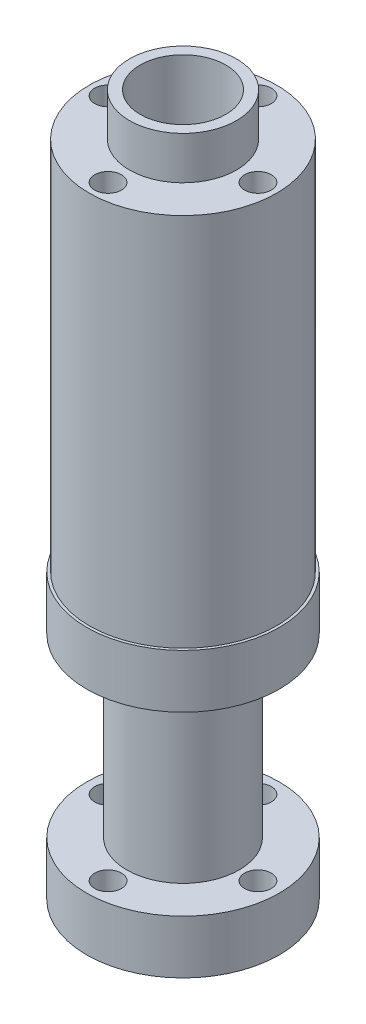
ISO-10303-21;
HEADER;
FILE_DESCRIPTION(('STEP AP214'),'2;1');
FILE_NAME('part.step','',(''),(''),'','','');
FILE_SCHEMA(('AUTOMOTIVE_DESIGN { 1 0 10303 214 1 1 1 1 }'));
ENDSEC;
DATA;
#1=APPLICATION_CONTEXT('core data for automotive mechanical design processes');
#2=APPLICATION_PROTOCOL_DEFINITION('international standard','automotive_design',2000,#1);
#3=PRODUCT_CONTEXT('',#1,'mechanical');
#4=PRODUCT('Part','Part','',(#3));
#5=PRODUCT_RELATED_PRODUCT_CATEGORY('part','',(#4));
#6=PRODUCT_DEFINITION_FORMATION('','',#4);
#7=PRODUCT_DEFINITION_CONTEXT('part definition',#1,'design');
#8=PRODUCT_DEFINITION('design','',#6,#7);
#9=PRODUCT_DEFINITION_SHAPE('','',#8);
#10=(LENGTH_UNIT() NAMED_UNIT(*) SI_UNIT(.MILLI.,.METRE.));
#11=(NAMED_UNIT(*) PLANE_ANGLE_UNIT() SI_UNIT($,.RADIAN.));
#12=(NAMED_UNIT(*) SI_UNIT($,.STERADIAN.) SOLID_ANGLE_UNIT());
#13=UNCERTAINTY_MEASURE_WITH_UNIT(LENGTH_MEASURE(1.E-05),#10,'distance_accuracy_value','');
#14=(GEOMETRIC_REPRESENTATION_CONTEXT(3) GLOBAL_UNCERTAINTY_ASSIGNED_CONTEXT((#13)) GLOBAL_UNIT_ASSIGNED_CONTEXT((#10,
#11,#12)) REPRESENTATION_CONTEXT('',''));
#15=CARTESIAN_POINT('',(0.,0.,0.));
#16=DIRECTION('',(0.,0.,1.));
#17=DIRECTION('',(1.,0.,0.));
#18=AXIS2_PLACEMENT_3D('',#15,#16,#17);
#19=CARTESIAN_POINT('',(0.,0.,0.));
#20=DIRECTION('',(0.,1.,0.));
#21=DIRECTION('',(0.,0.,1.));
#22=AXIS2_PLACEMENT_3D('',#19,#20,#21);
#23=PLANE('',#22);
#24=CARTESIAN_POINT('',(0.,0.,0.));
#25=DIRECTION('',(0.,1.,0.));
#26=DIRECTION('',(0.,0.,1.));
#27=AXIS2_PLACEMENT_3D('',#24,#25,#26);
#28=CIRCLE('',#27,9.);
#29=CARTESIAN_POINT('',(0.,0.,9.));
#30=VERTEX_POINT('',#29);
#31=EDGE_CURVE('E160',#30,#30,#28,.T.);
#32=ORIENTED_EDGE('',*,*,#31,.F.);
#33=EDGE_LOOP('',(#32));
#34=FACE_BOUND('',#33,.T.);
#35=CARTESIAN_POINT('',(0.,0.,-7.));
#36=DIRECTION('',(0.,-1.,0.));
#37=DIRECTION('',(0.,0.,-1.));
#38=AXIS2_PLACEMENT_3D('',#35,#36,#37);
#39=CIRCLE('',#38,1.25);
#40=CARTESIAN_POINT('',(0.,0.,-8.25));
#41=VERTEX_POINT('',#40);
#42=EDGE_CURVE('E152',#41,#41,#39,.T.);
#43=ORIENTED_EDGE('',*,*,#42,.F.);
#44=EDGE_LOOP('',(#43));
#45=FACE_BOUND('',#44,.T.);
#46=CARTESIAN_POINT('',(7.,0.,0.));
#47=DIRECTION('',(0.,-1.,0.));
#48=DIRECTION('',(0.,0.,-1.));
#49=AXIS2_PLACEMENT_3D('',#46,#47,#48);
#50=CIRCLE('',#49,1.25);
#51=CARTESIAN_POINT('',(7.,0.,-1.25));
#52=VERTEX_POINT('',#51);
#53=EDGE_CURVE('E144',#52,#52,#50,.T.);
#54=ORIENTED_EDGE('',*,*,#53,.F.);
#55=EDGE_LOOP('',(#54));
#56=FACE_BOUND('',#55,.T.);
#57=CARTESIAN_POINT('',(0.,0.,7.));
#58=DIRECTION('',(0.,-1.,0.));
#59=DIRECTION('',(0.,0.,-1.));
#60=AXIS2_PLACEMENT_3D('',#57,#58,#59);
#61=CIRCLE('',#60,1.25);
#62=CARTESIAN_POINT('',(0.,0.,5.75));
#63=VERTEX_POINT('',#62);
#64=EDGE_CURVE('E136',#63,#63,#61,.T.);
#65=ORIENTED_EDGE('',*,*,#64,.F.);
#66=EDGE_LOOP('',(#65));
#67=FACE_BOUND('',#66,.T.);
#68=CARTESIAN_POINT('',(-7.,0.,0.));
#69=DIRECTION('',(0.,-1.,0.));
#70=DIRECTION('',(0.,0.,-1.));
#71=AXIS2_PLACEMENT_3D('',#68,#69,#70);
#72=CIRCLE('',#71,1.25);
#73=CARTESIAN_POINT('',(-7.,0.,-1.25));
#74=VERTEX_POINT('',#73);
#75=EDGE_CURVE('E128',#74,#74,#72,.T.);
#76=ORIENTED_EDGE('',*,*,#75,.F.);
#77=EDGE_LOOP('',(#76));
#78=FACE_BOUND('',#77,.T.);
#79=CARTESIAN_POINT('',(0.,0.,0.));
#80=DIRECTION('',(0.,1.,0.));
#81=DIRECTION('',(0.,0.,1.));
#82=AXIS2_PLACEMENT_3D('',#79,#80,#81);
#83=CIRCLE('',#82,5.);
#84=CARTESIAN_POINT('',(0.,0.,5.));
#85=VERTEX_POINT('',#84);
#86=EDGE_CURVE('E115',#85,#85,#83,.F.);
#87=ORIENTED_EDGE('',*,*,#86,.F.);
#88=EDGE_LOOP('',(#87));
#89=FACE_BOUND('',#88,.T.);
#90=ADVANCED_FACE('F41',(#34,#45,#56,#67,#78,#89),#23,.F.);
#91=CARTESIAN_POINT('',(0.,5.,0.));
#92=DIRECTION('',(0.,1.,0.));
#93=DIRECTION('',(0.,0.,1.));
#94=AXIS2_PLACEMENT_3D('',#91,#92,#93);
#95=PLANE('',#94);
#96=CARTESIAN_POINT('',(0.,5.,0.));
#97=DIRECTION('',(0.,1.,0.));
#98=DIRECTION('',(0.,0.,1.));
#99=AXIS2_PLACEMENT_3D('',#96,#97,#98);
#100=CIRCLE('',#99,5.25);
#101=CARTESIAN_POINT('',(0.,5.,5.25));
#102=VERTEX_POINT('',#101);
#103=EDGE_CURVE('E121',#102,#102,#100,.T.);
#104=ORIENTED_EDGE('',*,*,#103,.F.);
#105=EDGE_LOOP('',(#104));
#106=FACE_BOUND('',#105,.T.);
#107=CARTESIAN_POINT('',(-7.,5.,0.));
#108=DIRECTION('',(0.,-1.,0.));
#109=DIRECTION('',(0.,0.,-1.));
#110=AXIS2_PLACEMENT_3D('',#107,#108,#109);
#111=CIRCLE('',#110,1.25);
#112=CARTESIAN_POINT('',(-7.,5.,-1.25));
#113=VERTEX_POINT('',#112);
#114=EDGE_CURVE('E132',#113,#113,#111,.T.);
#115=ORIENTED_EDGE('',*,*,#114,.T.);
#116=EDGE_LOOP('',(#115));
#117=FACE_BOUND('',#116,.T.);
#118=CARTESIAN_POINT('',(0.,5.,7.));
#119=DIRECTION('',(0.,-1.,0.));
#120=DIRECTION('',(0.,0.,-1.));
#121=AXIS2_PLACEMENT_3D('',#118,#119,#120);
#122=CIRCLE('',#121,1.25);
#123=CARTESIAN_POINT('',(0.,5.,5.75));
#124=VERTEX_POINT('',#123);
#125=EDGE_CURVE('E140',#124,#124,#122,.T.);
#126=ORIENTED_EDGE('',*,*,#125,.T.);
#127=EDGE_LOOP('',(#126));
#128=FACE_BOUND('',#127,.T.);
#129=CARTESIAN_POINT('',(7.,5.,0.));
#130=DIRECTION('',(0.,-1.,0.));
#131=DIRECTION('',(0.,0.,-1.));
#132=AXIS2_PLACEMENT_3D('',#129,#130,#131);
#133=CIRCLE('',#132,1.25);
#134=CARTESIAN_POINT('',(7.,5.,-1.25));
#135=VERTEX_POINT('',#134);
#136=EDGE_CURVE('E148',#135,#135,#133,.T.);
#137=ORIENTED_EDGE('',*,*,#136,.T.);
#138=EDGE_LOOP('',(#137));
#139=FACE_BOUND('',#138,.T.);
#140=CARTESIAN_POINT('',(0.,5.,-7.));
#141=DIRECTION('',(0.,-1.,0.));
#142=DIRECTION('',(0.,0.,-1.));
#143=AXIS2_PLACEMENT_3D('',#140,#141,#142);
#144=CIRCLE('',#143,1.25);
#145=CARTESIAN_POINT('',(0.,5.,-8.25));
#146=VERTEX_POINT('',#145);
#147=EDGE_CURVE('E156',#146,#146,#144,.T.);
#148=ORIENTED_EDGE('',*,*,#147,.T.);
#149=EDGE_LOOP('',(#148));
#150=FACE_BOUND('',#149,.T.);
#151=CARTESIAN_POINT('',(0.,5.,0.));
#152=DIRECTION('',(0.,1.,0.));
#153=DIRECTION('',(0.,0.,1.));
#154=AXIS2_PLACEMENT_3D('',#151,#152,#153);
#155=CIRCLE('',#154,9.);
#156=CARTESIAN_POINT('',(0.,5.,9.));
#157=VERTEX_POINT('',#156);
#158=EDGE_CURVE('E116',#157,#157,#155,.T.);
#159=ORIENTED_EDGE('',*,*,#158,.T.);
#160=EDGE_LOOP('',(#159));
#161=FACE_BOUND('',#160,.T.);
#162=ADVANCED_FACE('F193',(#106,#117,#128,#139,#150,#161),#95,.T.);
#163=CARTESIAN_POINT('',(0.,5.,0.));
#164=DIRECTION('',(0.,-1.,0.));
#165=DIRECTION('',(0.,0.,-1.));
#166=AXIS2_PLACEMENT_3D('',#163,#164,#165);
#167=CYLINDRICAL_SURFACE('',#166,9.);
#168=ORIENTED_EDGE('',*,*,#158,.F.);
#169=EDGE_LOOP('',(#168));
#170=FACE_BOUND('',#169,.T.);
#171=ORIENTED_EDGE('',*,*,#31,.T.);
#172=EDGE_LOOP('',(#171));
#173=FACE_BOUND('',#172,.T.);
#174=ADVANCED_FACE('F199',(#170,#173),#167,.T.);
#175=CARTESIAN_POINT('',(0.,5.,0.));
#176=DIRECTION('',(0.,-1.,0.));
#177=DIRECTION('',(0.,0.,-1.));
#178=AXIS2_PLACEMENT_3D('',#175,#176,#177);
#179=CYLINDRICAL_SURFACE('',#178,4.);
#180=CARTESIAN_POINT('',(0.,65.5,0.));
#181=DIRECTION('',(0.,1.,0.));
#182=DIRECTION('',(0.,0.,1.));
#183=AXIS2_PLACEMENT_3D('',#180,#181,#182);
#184=CIRCLE('',#183,4.);
#185=CARTESIAN_POINT('',(0.,65.5,4.));
#186=VERTEX_POINT('',#185);
#187=EDGE_CURVE('E167',#186,#186,#184,.T.);
#188=ORIENTED_EDGE('',*,*,#187,.T.);
#189=EDGE_LOOP('',(#188));
#190=FACE_BOUND('',#189,.T.);
#191=CARTESIAN_POINT('',(0.,-2.,0.));
#192=DIRECTION('',(0.,-1.,0.));
#193=DIRECTION('',(0.,0.,-1.));
#194=AXIS2_PLACEMENT_3D('',#191,#192,#193);
#195=CIRCLE('',#194,4.);
#196=CARTESIAN_POINT('',(0.,-2.,-4.));
#197=VERTEX_POINT('',#196);
#198=EDGE_CURVE('E297',#197,#197,#195,.T.);
#199=ORIENTED_EDGE('',*,*,#198,.T.);
#200=EDGE_LOOP('',(#199));
#201=FACE_BOUND('',#200,.T.);
#202=ADVANCED_FACE('F206',(#190,#201),#179,.F.);
#203=CARTESIAN_POINT('',(0.,0.,-7.));
#204=DIRECTION('',(0.,-1.,0.));
#205=DIRECTION('',(0.,0.,-1.));
#206=AXIS2_PLACEMENT_3D('',#203,#204,#205);
#207=CYLINDRICAL_SURFACE('',#206,1.25);
#208=ORIENTED_EDGE('',*,*,#147,.F.);
#209=EDGE_LOOP('',(#208));
#210=FACE_BOUND('',#209,.T.);
#211=ORIENTED_EDGE('',*,*,#42,.T.);
#212=EDGE_LOOP('',(#211));
#213=FACE_BOUND('',#212,.T.);
#214=ADVANCED_FACE('F211',(#210,#213),#207,.F.);
#215=CARTESIAN_POINT('',(7.,0.,0.));
#216=DIRECTION('',(0.,-1.,0.));
#217=DIRECTION('',(0.,0.,-1.));
#218=AXIS2_PLACEMENT_3D('',#215,#216,#217);
#219=CYLINDRICAL_SURFACE('',#218,1.25);
#220=ORIENTED_EDGE('',*,*,#136,.F.);
#221=EDGE_LOOP('',(#220));
#222=FACE_BOUND('',#221,.T.);
#223=ORIENTED_EDGE('',*,*,#53,.T.);
#224=EDGE_LOOP('',(#223));
#225=FACE_BOUND('',#224,.T.);
#226=ADVANCED_FACE('F219',(#222,#225),#219,.F.);
#227=CARTESIAN_POINT('',(0.,0.,7.));
#228=DIRECTION('',(0.,-1.,0.));
#229=DIRECTION('',(0.,0.,-1.));
#230=AXIS2_PLACEMENT_3D('',#227,#228,#229);
#231=CYLINDRICAL_SURFACE('',#230,1.25);
#232=ORIENTED_EDGE('',*,*,#125,.F.);
#233=EDGE_LOOP('',(#232));
#234=FACE_BOUND('',#233,.T.);
#235=ORIENTED_EDGE('',*,*,#64,.T.);
#236=EDGE_LOOP('',(#235));
#237=FACE_BOUND('',#236,.T.);
#238=ADVANCED_FACE('F226',(#234,#237),#231,.F.);
#239=CARTESIAN_POINT('',(-7.,0.,0.));
#240=DIRECTION('',(0.,-1.,0.));
#241=DIRECTION('',(0.,0.,-1.));
#242=AXIS2_PLACEMENT_3D('',#239,#240,#241);
#243=CYLINDRICAL_SURFACE('',#242,1.25);
#244=ORIENTED_EDGE('',*,*,#114,.F.);
#245=EDGE_LOOP('',(#244));
#246=FACE_BOUND('',#245,.T.);
#247=ORIENTED_EDGE('',*,*,#75,.T.);
#248=EDGE_LOOP('',(#247));
#249=FACE_BOUND('',#248,.T.);
#250=ADVANCED_FACE('F230',(#246,#249),#243,.F.);
#251=CARTESIAN_POINT('',(0.,21.5,0.));
#252=DIRECTION('',(0.,-1.,0.));
#253=DIRECTION('',(0.,0.,-1.));
#254=AXIS2_PLACEMENT_3D('',#251,#252,#253);
#255=CYLINDRICAL_SURFACE('',#254,5.25);
#256=CARTESIAN_POINT('',(0.,19.5,0.));
#257=DIRECTION('',(0.,1.,0.));
#258=DIRECTION('',(0.,0.,1.));
#259=AXIS2_PLACEMENT_3D('',#256,#257,#258);
#260=CIRCLE('',#259,5.25);
#261=CARTESIAN_POINT('',(0.,19.5,5.25));
#262=VERTEX_POINT('',#261);
#263=EDGE_CURVE('E11',#262,#262,#260,.F.);
#264=ORIENTED_EDGE('',*,*,#263,.T.);
#265=EDGE_LOOP('',(#264));
#266=FACE_BOUND('',#265,.T.);
#267=ORIENTED_EDGE('',*,*,#103,.T.);
#268=EDGE_LOOP('',(#267));
#269=FACE_BOUND('',#268,.T.);
#270=ADVANCED_FACE('F234',(#266,#269),#255,.T.);
#271=CARTESIAN_POINT('',(0.,26.5,0.));
#272=DIRECTION('',(0.,-1.,0.));
#273=DIRECTION('',(0.,0.,-1.));
#274=AXIS2_PLACEMENT_3D('',#271,#272,#273);
#275=CYLINDRICAL_SURFACE('',#274,9.);
#276=CARTESIAN_POINT('',(0.,26.5,0.));
#277=DIRECTION('',(0.,1.,0.));
#278=DIRECTION('',(0.,0.,1.));
#279=AXIS2_PLACEMENT_3D('',#276,#277,#278);
#280=CIRCLE('',#279,9.);
#281=CARTESIAN_POINT('',(0.,26.5,9.));
#282=VERTEX_POINT('',#281);
#283=EDGE_CURVE('E117',#282,#282,#280,.T.);
#284=ORIENTED_EDGE('',*,*,#283,.F.);
#285=EDGE_LOOP('',(#284));
#286=FACE_BOUND('',#285,.T.);
#287=CARTESIAN_POINT('',(0.,21.5,0.));
#288=DIRECTION('',(0.,1.,0.));
#289=DIRECTION('',(0.,0.,1.));
#290=AXIS2_PLACEMENT_3D('',#287,#288,#289);
#291=CIRCLE('',#290,9.);
#292=CARTESIAN_POINT('',(0.,21.5,9.));
#293=VERTEX_POINT('',#292);
#294=EDGE_CURVE('E110',#293,#293,#291,.T.);
#295=ORIENTED_EDGE('',*,*,#294,.T.);
#296=EDGE_LOOP('',(#295));
#297=FACE_BOUND('',#296,.T.);
#298=ADVANCED_FACE('F238',(#286,#297),#275,.T.);
#299=CARTESIAN_POINT('',(0.,26.5,0.));
#300=DIRECTION('',(0.,1.,0.));
#301=DIRECTION('',(0.,0.,1.));
#302=AXIS2_PLACEMENT_3D('',#299,#300,#301);
#303=PLANE('',#302);
#304=CARTESIAN_POINT('',(0.,26.5,0.));
#305=DIRECTION('',(0.,1.,0.));
#306=DIRECTION('',(0.,0.,1.));
#307=AXIS2_PLACEMENT_3D('',#304,#305,#306);
#308=CIRCLE('',#307,8.75);
#309=CARTESIAN_POINT('',(0.,26.5,8.75));
#310=VERTEX_POINT('',#309);
#311=EDGE_CURVE('E111',#310,#310,#308,.T.);
#312=ORIENTED_EDGE('',*,*,#311,.F.);
#313=EDGE_LOOP('',(#312));
#314=FACE_BOUND('',#313,.T.);
#315=ORIENTED_EDGE('',*,*,#283,.T.);
#316=EDGE_LOOP('',(#315));
#317=FACE_BOUND('',#316,.T.);
#318=ADVANCED_FACE('F242',(#314,#317),#303,.T.);
#319=CARTESIAN_POINT('',(0.,21.5,0.));
#320=DIRECTION('',(0.,1.,0.));
#321=DIRECTION('',(0.,0.,1.));
#322=AXIS2_PLACEMENT_3D('',#319,#320,#321);
#323=PLANE('',#322);
#324=CARTESIAN_POINT('',(0.,21.5,0.));
#325=DIRECTION('',(0.,1.,0.));
#326=DIRECTION('',(0.,0.,1.));
#327=AXIS2_PLACEMENT_3D('',#324,#325,#326);
#328=CIRCLE('',#327,7.25);
#329=CARTESIAN_POINT('',(0.,21.5,7.25));
#330=VERTEX_POINT('',#329);
#331=EDGE_CURVE('E50',#330,#330,#328,.T.);
#332=ORIENTED_EDGE('',*,*,#331,.T.);
#333=EDGE_LOOP('',(#332));
#334=FACE_BOUND('',#333,.T.);
#335=ORIENTED_EDGE('',*,*,#294,.F.);
#336=EDGE_LOOP('',(#335));
#337=FACE_BOUND('',#336,.T.);
#338=ADVANCED_FACE('F179',(#334,#337),#323,.F.);
#339=CARTESIAN_POINT('',(0.,61.5,0.));
#340=DIRECTION('',(0.,-1.,0.));
#341=DIRECTION('',(0.,0.,-1.));
#342=AXIS2_PLACEMENT_3D('',#339,#340,#341);
#343=CYLINDRICAL_SURFACE('',#342,8.75);
#344=CARTESIAN_POINT('',(0.,61.5,0.));
#345=DIRECTION('',(0.,1.,0.));
#346=DIRECTION('',(0.,0.,1.));
#347=AXIS2_PLACEMENT_3D('',#344,#345,#346);
#348=CIRCLE('',#347,8.75);
#349=CARTESIAN_POINT('',(0.,61.5,8.75));
#350=VERTEX_POINT('',#349);
#351=EDGE_CURVE('E106',#350,#350,#348,.T.);
#352=ORIENTED_EDGE('',*,*,#351,.F.);
#353=EDGE_LOOP('',(#352));
#354=FACE_BOUND('',#353,.T.);
#355=ORIENTED_EDGE('',*,*,#311,.T.);
#356=EDGE_LOOP('',(#355));
#357=FACE_BOUND('',#356,.T.);
#358=ADVANCED_FACE('F246',(#354,#357),#343,.T.);
#359=CARTESIAN_POINT('',(0.,61.5,0.));
#360=DIRECTION('',(0.,1.,0.));
#361=DIRECTION('',(0.,0.,1.));
#362=AXIS2_PLACEMENT_3D('',#359,#360,#361);
#363=PLANE('',#362);
#364=CARTESIAN_POINT('',(0.,61.5,0.));
#365=DIRECTION('',(0.,1.,0.));
#366=DIRECTION('',(0.,0.,1.));
#367=AXIS2_PLACEMENT_3D('',#364,#365,#366);
#368=CIRCLE('',#367,5.);
#369=CARTESIAN_POINT('',(0.,61.5,5.));
#370=VERTEX_POINT('',#369);
#371=EDGE_CURVE('E171',#370,#370,#368,.T.);
#372=ORIENTED_EDGE('',*,*,#371,.F.);
#373=EDGE_LOOP('',(#372));
#374=FACE_BOUND('',#373,.T.);
#375=CARTESIAN_POINT('',(0.,61.5,-7.));
#376=DIRECTION('',(0.,1.,0.));
#377=DIRECTION('',(0.,0.,1.));
#378=AXIS2_PLACEMENT_3D('',#375,#376,#377);
#379=CIRCLE('',#378,1.24999999999999);
#380=CARTESIAN_POINT('',(0.,61.5,-5.75000000000001));
#381=VERTEX_POINT('',#380);
#382=EDGE_CURVE('E75',#381,#381,#379,.T.);
#383=ORIENTED_EDGE('',*,*,#382,.F.);
#384=EDGE_LOOP('',(#383));
#385=FACE_BOUND('',#384,.T.);
#386=CARTESIAN_POINT('',(-7.,61.5,0.));
#387=DIRECTION('',(0.,1.,0.));
#388=DIRECTION('',(0.,0.,1.));
#389=AXIS2_PLACEMENT_3D('',#386,#387,#388);
#390=CIRCLE('',#389,1.24999999999999);
#391=CARTESIAN_POINT('',(-7.,61.5,1.24999999999999));
#392=VERTEX_POINT('',#391);
#393=EDGE_CURVE('E74',#392,#392,#390,.T.);
#394=ORIENTED_EDGE('',*,*,#393,.F.);
#395=EDGE_LOOP('',(#394));
#396=FACE_BOUND('',#395,.T.);
#397=CARTESIAN_POINT('',(7.,61.5,0.));
#398=DIRECTION('',(0.,1.,0.));
#399=DIRECTION('',(0.,0.,1.));
#400=AXIS2_PLACEMENT_3D('',#397,#398,#399);
#401=CIRCLE('',#400,1.24999999999999);
#402=CARTESIAN_POINT('',(7.,61.5,1.24999999999999));
#403=VERTEX_POINT('',#402);
#404=EDGE_CURVE('E90',#403,#403,#401,.T.);
#405=ORIENTED_EDGE('',*,*,#404,.F.);
#406=EDGE_LOOP('',(#405));
#407=FACE_BOUND('',#406,.T.);
#408=CARTESIAN_POINT('',(0.,61.5,7.));
#409=DIRECTION('',(0.,1.,0.));
#410=DIRECTION('',(0.,0.,1.));
#411=AXIS2_PLACEMENT_3D('',#408,#409,#410);
#412=CIRCLE('',#411,1.24999999999999);
#413=CARTESIAN_POINT('',(0.,61.5,8.24999999999999));
#414=VERTEX_POINT('',#413);
#415=EDGE_CURVE('E98',#414,#414,#412,.T.);
#416=ORIENTED_EDGE('',*,*,#415,.F.);
#417=EDGE_LOOP('',(#416));
#418=FACE_BOUND('',#417,.T.);
#419=ORIENTED_EDGE('',*,*,#351,.T.);
#420=EDGE_LOOP('',(#419));
#421=FACE_BOUND('',#420,.T.);
#422=ADVANCED_FACE('F252',(#374,#385,#396,#407,#418,#421),#363,.T.);
#423=CARTESIAN_POINT('',(0.,51.5,7.));
#424=DIRECTION('',(0.,1.,0.));
#425=DIRECTION('',(0.,0.,1.));
#426=AXIS2_PLACEMENT_3D('',#423,#424,#425);
#427=CONICAL_SURFACE('',#426,1.25,1.02974425867666);
#428=CARTESIAN_POINT('',(0.,50.7489242262156,7.));
#429=VERTEX_POINT('',#428);
#430=VERTEX_LOOP('',#429);
#431=FACE_BOUND('',#430,.T.);
#432=CARTESIAN_POINT('',(0.,51.5,7.));
#433=DIRECTION('',(0.,1.,0.));
#434=DIRECTION('',(0.,0.,1.));
#435=AXIS2_PLACEMENT_3D('',#432,#433,#434);
#436=CIRCLE('',#435,1.25);
#437=CARTESIAN_POINT('',(0.,51.5,8.25));
#438=VERTEX_POINT('',#437);
#439=EDGE_CURVE('E102',#438,#438,#436,.T.);
#440=ORIENTED_EDGE('',*,*,#439,.T.);
#441=EDGE_LOOP('',(#440));
#442=FACE_BOUND('',#441,.T.);
#443=ADVANCED_FACE('F256',(#431,#442),#427,.F.);
#444=CARTESIAN_POINT('',(0.,61.5,7.));
#445=DIRECTION('',(0.,1.,0.));
#446=DIRECTION('',(0.,0.,1.));
#447=AXIS2_PLACEMENT_3D('',#444,#445,#446);
#448=CYLINDRICAL_SURFACE('',#447,1.24999999999999);
#449=ORIENTED_EDGE('',*,*,#439,.F.);
#450=EDGE_LOOP('',(#449));
#451=FACE_BOUND('',#450,.T.);
#452=ORIENTED_EDGE('',*,*,#415,.T.);
#453=EDGE_LOOP('',(#452));
#454=FACE_BOUND('',#453,.T.);
#455=ADVANCED_FACE('F260',(#451,#454),#448,.F.);
#456=CARTESIAN_POINT('',(7.,51.5,0.));
#457=DIRECTION('',(0.,1.,0.));
#458=DIRECTION('',(0.,0.,1.));
#459=AXIS2_PLACEMENT_3D('',#456,#457,#458);
#460=CONICAL_SURFACE('',#459,1.25,1.02974425867666);
#461=CARTESIAN_POINT('',(7.,50.7489242262156,0.));
#462=VERTEX_POINT('',#461);
#463=VERTEX_LOOP('',#462);
#464=FACE_BOUND('',#463,.T.);
#465=CARTESIAN_POINT('',(7.,51.5,0.));
#466=DIRECTION('',(0.,1.,0.));
#467=DIRECTION('',(0.,0.,1.));
#468=AXIS2_PLACEMENT_3D('',#465,#466,#467);
#469=CIRCLE('',#468,1.25);
#470=CARTESIAN_POINT('',(7.,51.5,1.25));
#471=VERTEX_POINT('',#470);
#472=EDGE_CURVE('E94',#471,#471,#469,.T.);
#473=ORIENTED_EDGE('',*,*,#472,.T.);
#474=EDGE_LOOP('',(#473));
#475=FACE_BOUND('',#474,.T.);
#476=ADVANCED_FACE('F263',(#464,#475),#460,.F.);
#477=CARTESIAN_POINT('',(7.,61.5,0.));
#478=DIRECTION('',(0.,1.,0.));
#479=DIRECTION('',(0.,0.,1.));
#480=AXIS2_PLACEMENT_3D('',#477,#478,#479);
#481=CYLINDRICAL_SURFACE('',#480,1.24999999999999);
#482=ORIENTED_EDGE('',*,*,#472,.F.);
#483=EDGE_LOOP('',(#482));
#484=FACE_BOUND('',#483,.T.);
#485=ORIENTED_EDGE('',*,*,#404,.T.);
#486=EDGE_LOOP('',(#485));
#487=FACE_BOUND('',#486,.T.);
#488=ADVANCED_FACE('F267',(#484,#487),#481,.F.);
#489=CARTESIAN_POINT('',(-7.,51.5,0.));
#490=DIRECTION('',(0.,1.,0.));
#491=DIRECTION('',(0.,0.,1.));
#492=AXIS2_PLACEMENT_3D('',#489,#490,#491);
#493=CONICAL_SURFACE('',#492,1.25,1.02974425867666);
#494=CARTESIAN_POINT('',(-7.,50.7489242262156,0.));
#495=VERTEX_POINT('',#494);
#496=VERTEX_LOOP('',#495);
#497=FACE_BOUND('',#496,.T.);
#498=CARTESIAN_POINT('',(-7.,51.5,0.));
#499=DIRECTION('',(0.,1.,0.));
#500=DIRECTION('',(0.,0.,1.));
#501=AXIS2_PLACEMENT_3D('',#498,#499,#500);
#502=CIRCLE('',#501,1.25);
#503=CARTESIAN_POINT('',(-7.,51.5,1.25));
#504=VERTEX_POINT('',#503);
#505=EDGE_CURVE('E80',#504,#504,#502,.T.);
#506=ORIENTED_EDGE('',*,*,#505,.T.);
#507=EDGE_LOOP('',(#506));
#508=FACE_BOUND('',#507,.T.);
#509=ADVANCED_FACE('F270',(#497,#508),#493,.F.);
#510=CARTESIAN_POINT('',(-7.,61.5,0.));
#511=DIRECTION('',(0.,1.,0.));
#512=DIRECTION('',(0.,0.,1.));
#513=AXIS2_PLACEMENT_3D('',#510,#511,#512);
#514=CYLINDRICAL_SURFACE('',#513,1.24999999999999);
#515=ORIENTED_EDGE('',*,*,#505,.F.);
#516=EDGE_LOOP('',(#515));
#517=FACE_BOUND('',#516,.T.);
#518=ORIENTED_EDGE('',*,*,#393,.T.);
#519=EDGE_LOOP('',(#518));
#520=FACE_BOUND('',#519,.T.);
#521=ADVANCED_FACE('F67',(#517,#520),#514,.F.);
#522=CARTESIAN_POINT('',(0.,51.5,-7.));
#523=DIRECTION('',(0.,1.,0.));
#524=DIRECTION('',(0.,0.,1.));
#525=AXIS2_PLACEMENT_3D('',#522,#523,#524);
#526=CONICAL_SURFACE('',#525,1.25,1.02974425867666);
#527=CARTESIAN_POINT('',(0.,50.7489242262156,-7.));
#528=VERTEX_POINT('',#527);
#529=VERTEX_LOOP('',#528);
#530=FACE_BOUND('',#529,.T.);
#531=CARTESIAN_POINT('',(0.,51.5,-7.));
#532=DIRECTION('',(0.,1.,0.));
#533=DIRECTION('',(0.,0.,1.));
#534=AXIS2_PLACEMENT_3D('',#531,#532,#533);
#535=CIRCLE('',#534,1.25);
#536=CARTESIAN_POINT('',(0.,51.5,-5.75));
#537=VERTEX_POINT('',#536);
#538=EDGE_CURVE('E71',#537,#537,#535,.T.);
#539=ORIENTED_EDGE('',*,*,#538,.T.);
#540=EDGE_LOOP('',(#539));
#541=FACE_BOUND('',#540,.T.);
#542=ADVANCED_FACE('F63',(#530,#541),#526,.F.);
#543=CARTESIAN_POINT('',(0.,61.5,-7.));
#544=DIRECTION('',(0.,1.,0.));
#545=DIRECTION('',(0.,0.,1.));
#546=AXIS2_PLACEMENT_3D('',#543,#544,#545);
#547=CYLINDRICAL_SURFACE('',#546,1.24999999999999);
#548=ORIENTED_EDGE('',*,*,#538,.F.);
#549=EDGE_LOOP('',(#548));
#550=FACE_BOUND('',#549,.T.);
#551=ORIENTED_EDGE('',*,*,#382,.T.);
#552=EDGE_LOOP('',(#551));
#553=FACE_BOUND('',#552,.T.);
#554=ADVANCED_FACE('F66',(#550,#553),#547,.F.);
#555=CARTESIAN_POINT('',(0.,65.5,0.));
#556=DIRECTION('',(0.,-1.,0.));
#557=DIRECTION('',(0.,0.,-1.));
#558=AXIS2_PLACEMENT_3D('',#555,#556,#557);
#559=CYLINDRICAL_SURFACE('',#558,5.);
#560=CARTESIAN_POINT('',(0.,65.5,0.));
#561=DIRECTION('',(0.,1.,0.));
#562=DIRECTION('',(0.,0.,1.));
#563=AXIS2_PLACEMENT_3D('',#560,#561,#562);
#564=CIRCLE('',#563,5.);
#565=CARTESIAN_POINT('',(0.,65.5,5.));
#566=VERTEX_POINT('',#565);
#567=EDGE_CURVE('E83',#566,#566,#564,.T.);
#568=ORIENTED_EDGE('',*,*,#567,.F.);
#569=EDGE_LOOP('',(#568));
#570=FACE_BOUND('',#569,.T.);
#571=ORIENTED_EDGE('',*,*,#371,.T.);
#572=EDGE_LOOP('',(#571));
#573=FACE_BOUND('',#572,.T.);
#574=ADVANCED_FACE('F280',(#570,#573),#559,.T.);
#575=CARTESIAN_POINT('',(0.,65.5,0.));
#576=DIRECTION('',(0.,1.,0.));
#577=DIRECTION('',(0.,0.,1.));
#578=AXIS2_PLACEMENT_3D('',#575,#576,#577);
#579=PLANE('',#578);
#580=ORIENTED_EDGE('',*,*,#187,.F.);
#581=EDGE_LOOP('',(#580));
#582=FACE_BOUND('',#581,.T.);
#583=ORIENTED_EDGE('',*,*,#567,.T.);
#584=EDGE_LOOP('',(#583));
#585=FACE_BOUND('',#584,.T.);
#586=ADVANCED_FACE('F283',(#582,#585),#579,.T.);
#587=CARTESIAN_POINT('',(0.,-2.,0.));
#588=DIRECTION('',(0.,-1.,0.));
#589=DIRECTION('',(0.,0.,-1.));
#590=AXIS2_PLACEMENT_3D('',#587,#588,#589);
#591=PLANE('',#590);
#592=CARTESIAN_POINT('',(0.,-2.,0.));
#593=DIRECTION('',(0.,-1.,0.));
#594=DIRECTION('',(0.,0.,-1.));
#595=AXIS2_PLACEMENT_3D('',#592,#593,#594);
#596=CIRCLE('',#595,5.);
#597=CARTESIAN_POINT('',(0.,-2.,-5.));
#598=VERTEX_POINT('',#597);
#599=EDGE_CURVE('E172',#598,#598,#596,.T.);
#600=ORIENTED_EDGE('',*,*,#599,.T.);
#601=EDGE_LOOP('',(#600));
#602=FACE_BOUND('',#601,.T.);
#603=ORIENTED_EDGE('',*,*,#198,.F.);
#604=EDGE_LOOP('',(#603));
#605=FACE_BOUND('',#604,.T.);
#606=ADVANCED_FACE('F188',(#602,#605),#591,.T.);
#607=CARTESIAN_POINT('',(0.,-2.,0.));
#608=DIRECTION('',(0.,1.,0.));
#609=DIRECTION('',(0.,0.,1.));
#610=AXIS2_PLACEMENT_3D('',#607,#608,#609);
#611=CYLINDRICAL_SURFACE('',#610,5.);
#612=ORIENTED_EDGE('',*,*,#599,.F.);
#613=EDGE_LOOP('',(#612));
#614=FACE_BOUND('',#613,.T.);
#615=ORIENTED_EDGE('',*,*,#86,.T.);
#616=EDGE_LOOP('',(#615));
#617=FACE_BOUND('',#616,.T.);
#618=ADVANCED_FACE('F183',(#614,#617),#611,.T.);
#619=CARTESIAN_POINT('',(0.,19.5,0.));
#620=DIRECTION('',(0.,1.,0.));
#621=DIRECTION('',(0.,0.,1.));
#622=AXIS2_PLACEMENT_3D('',#619,#620,#621);
#623=TOROIDAL_SURFACE('',#622,7.25,2.);
#624=ORIENTED_EDGE('',*,*,#263,.F.);
#625=EDGE_LOOP('',(#624));
#626=FACE_BOUND('',#625,.T.);
#627=ORIENTED_EDGE('',*,*,#331,.F.);
#628=EDGE_LOOP('',(#627));
#629=FACE_BOUND('',#628,.T.);
#630=ADVANCED_FACE('F43',(#626,#629),#623,.F.);
#631=CLOSED_SHELL('',(#90,#162,#174,#202,#214,#226,#238,#250,#270,#298,#318,#338,#358,#422,#443,
#455,#476,#488,#509,#521,#542,#554,#574,#586,#606,#618,#630));
#632=MANIFOLD_SOLID_BREP('B2',#631);
#633=ADVANCED_BREP_SHAPE_REPRESENTATION('',(#18,#632),#14);
#634=SHAPE_DEFINITION_REPRESENTATION(#9,#633);
ENDSEC;
END-ISO-10303-21;
